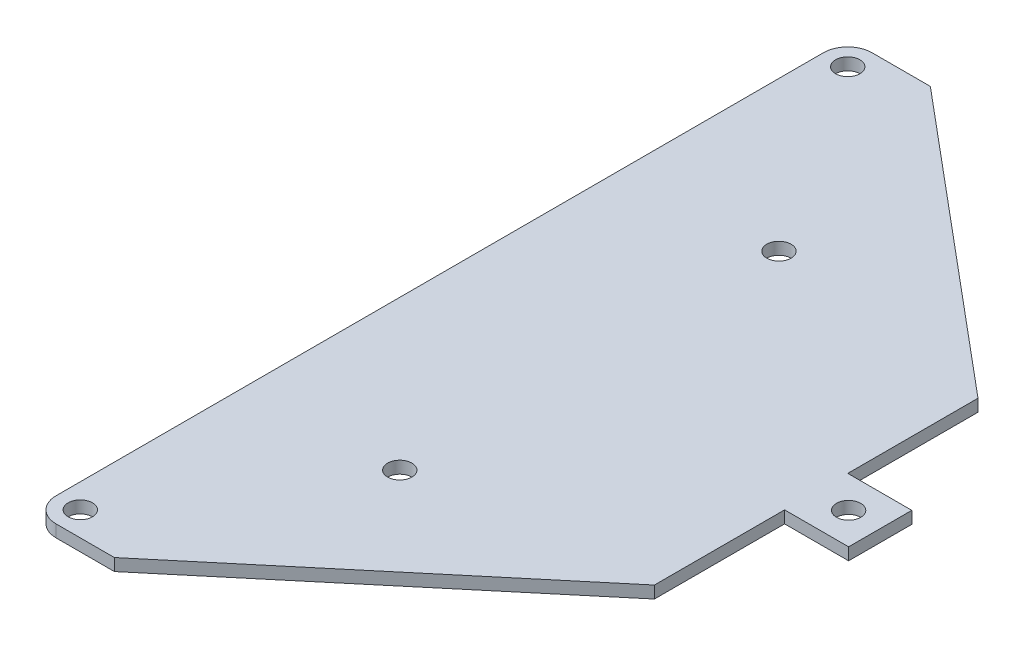
ISO-10303-21;
HEADER;
FILE_DESCRIPTION(('STEP AP214'),'2;1');
FILE_NAME('part.step','',(''),(''),'','','');
FILE_SCHEMA(('AUTOMOTIVE_DESIGN { 1 0 10303 214 1 1 1 1 }'));
ENDSEC;
DATA;
#1=APPLICATION_CONTEXT('core data for automotive mechanical design processes');
#2=APPLICATION_PROTOCOL_DEFINITION('international standard','automotive_design',2000,#1);
#3=PRODUCT_CONTEXT('',#1,'mechanical');
#4=PRODUCT('Part','Part','',(#3));
#5=PRODUCT_RELATED_PRODUCT_CATEGORY('part','',(#4));
#6=PRODUCT_DEFINITION_FORMATION('','',#4);
#7=PRODUCT_DEFINITION_CONTEXT('part definition',#1,'design');
#8=PRODUCT_DEFINITION('design','',#6,#7);
#9=PRODUCT_DEFINITION_SHAPE('','',#8);
#10=(LENGTH_UNIT() NAMED_UNIT(*) SI_UNIT(.MILLI.,.METRE.));
#11=(NAMED_UNIT(*) PLANE_ANGLE_UNIT() SI_UNIT($,.RADIAN.));
#12=(NAMED_UNIT(*) SI_UNIT($,.STERADIAN.) SOLID_ANGLE_UNIT());
#13=UNCERTAINTY_MEASURE_WITH_UNIT(LENGTH_MEASURE(1.E-05),#10,'distance_accuracy_value','');
#14=(GEOMETRIC_REPRESENTATION_CONTEXT(3) GLOBAL_UNCERTAINTY_ASSIGNED_CONTEXT((#13)) GLOBAL_UNIT_ASSIGNED_CONTEXT((#10,
#11,#12)) REPRESENTATION_CONTEXT('',''));
#15=CARTESIAN_POINT('',(0.,0.,0.));
#16=DIRECTION('',(0.,0.,1.));
#17=DIRECTION('',(1.,0.,0.));
#18=AXIS2_PLACEMENT_3D('',#15,#16,#17);
#19=CARTESIAN_POINT('',(0.,1.5,0.));
#20=DIRECTION('',(0.,-1.,0.));
#21=DIRECTION('',(0.,0.,-1.));
#22=AXIS2_PLACEMENT_3D('',#19,#20,#21);
#23=PLANE('',#22);
#24=DIRECTION('',(0.,0.,-1.));
#25=VECTOR('',#24,1.);
#26=CARTESIAN_POINT('',(43.47,1.5,43.46));
#27=LINE('',#26,#25);
#28=CARTESIAN_POINT('',(43.47,1.5,43.46));
#29=VERTEX_POINT('',#28);
#30=CARTESIAN_POINT('',(43.47,1.5,27.39));
#31=VERTEX_POINT('',#30);
#32=EDGE_CURVE('E181',#29,#31,#27,.T.);
#33=ORIENTED_EDGE('',*,*,#32,.T.);
#34=DIRECTION('',(-0.766503610582019,0.,-0.642239997948375));
#35=VECTOR('',#34,1.);
#36=CARTESIAN_POINT('',(43.47,1.5,27.39));
#37=LINE('',#36,#35);
#38=CARTESIAN_POINT('',(7.20000000000001,1.5,-3.));
#39=VERTEX_POINT('',#38);
#40=EDGE_CURVE('E112',#31,#39,#37,.T.);
#41=ORIENTED_EDGE('',*,*,#40,.T.);
#42=DIRECTION('',(-1.,0.,0.));
#43=VECTOR('',#42,1.);
#44=CARTESIAN_POINT('',(7.20000000000001,1.5,-3.));
#45=LINE('',#44,#43);
#46=CARTESIAN_POINT('',(0.,1.5,-3.));
#47=VERTEX_POINT('',#46);
#48=EDGE_CURVE('E209',#39,#47,#45,.T.);
#49=ORIENTED_EDGE('',*,*,#48,.T.);
#50=CARTESIAN_POINT('',(0.,1.5,0.));
#51=DIRECTION('',(0.,1.,0.));
#52=DIRECTION('',(0.,0.,-1.));
#53=AXIS2_PLACEMENT_3D('',#50,#51,#52);
#54=CIRCLE('',#53,3.);
#55=CARTESIAN_POINT('',(-3.,1.5,0.));
#56=VERTEX_POINT('',#55);
#57=EDGE_CURVE('E226',#47,#56,#54,.T.);
#58=ORIENTED_EDGE('',*,*,#57,.T.);
#59=DIRECTION('',(0.,0.,1.));
#60=VECTOR('',#59,1.);
#61=CARTESIAN_POINT('',(-3.,1.5,94.72));
#62=LINE('',#61,#60);
#63=CARTESIAN_POINT('',(-2.99999999999999,1.5,94.72));
#64=VERTEX_POINT('',#63);
#65=EDGE_CURVE('E227',#56,#64,#62,.T.);
#66=ORIENTED_EDGE('',*,*,#65,.T.);
#67=CARTESIAN_POINT('',(0.,1.5,94.72));
#68=DIRECTION('',(0.,1.,0.));
#69=DIRECTION('',(0.,0.,-1.));
#70=AXIS2_PLACEMENT_3D('',#67,#68,#69);
#71=CIRCLE('',#70,3.00000000000001);
#72=CARTESIAN_POINT('',(0.,1.5,97.72));
#73=VERTEX_POINT('',#72);
#74=EDGE_CURVE('E229',#64,#73,#71,.T.);
#75=ORIENTED_EDGE('',*,*,#74,.T.);
#76=DIRECTION('',(1.,0.,0.));
#77=VECTOR('',#76,1.);
#78=CARTESIAN_POINT('',(0.,1.5,97.72));
#79=LINE('',#78,#77);
#80=CARTESIAN_POINT('',(7.20000000000002,1.5,97.72));
#81=VERTEX_POINT('',#80);
#82=EDGE_CURVE('E231',#73,#81,#79,.T.);
#83=ORIENTED_EDGE('',*,*,#82,.T.);
#84=DIRECTION('',(0.766503610582019,0.,-0.642239997948375));
#85=VECTOR('',#84,1.);
#86=CARTESIAN_POINT('',(7.20000000000002,1.5,97.72));
#87=LINE('',#86,#85);
#88=CARTESIAN_POINT('',(43.47,1.5,67.33));
#89=VERTEX_POINT('',#88);
#90=EDGE_CURVE('E240',#81,#89,#87,.T.);
#91=ORIENTED_EDGE('',*,*,#90,.T.);
#92=DIRECTION('',(0.,0.,-1.));
#93=VECTOR('',#92,1.);
#94=CARTESIAN_POINT('',(43.47,1.5,67.33));
#95=LINE('',#94,#93);
#96=CARTESIAN_POINT('',(43.47,1.5,51.26));
#97=VERTEX_POINT('',#96);
#98=EDGE_CURVE('E142',#89,#97,#95,.T.);
#99=ORIENTED_EDGE('',*,*,#98,.T.);
#100=DIRECTION('',(1.,0.,0.));
#101=VECTOR('',#100,1.);
#102=CARTESIAN_POINT('',(51.37,1.5,51.26));
#103=LINE('',#102,#101);
#104=CARTESIAN_POINT('',(51.37,1.5,51.26));
#105=VERTEX_POINT('',#104);
#106=EDGE_CURVE('E136',#97,#105,#103,.T.);
#107=ORIENTED_EDGE('',*,*,#106,.T.);
#108=DIRECTION('',(0.,0.,-1.));
#109=VECTOR('',#108,1.);
#110=CARTESIAN_POINT('',(51.37,1.5,43.46));
#111=LINE('',#110,#109);
#112=CARTESIAN_POINT('',(51.37,1.5,43.46));
#113=VERTEX_POINT('',#112);
#114=EDGE_CURVE('E140',#105,#113,#111,.T.);
#115=ORIENTED_EDGE('',*,*,#114,.T.);
#116=DIRECTION('',(-1.,0.,0.));
#117=VECTOR('',#116,1.);
#118=CARTESIAN_POINT('',(43.47,1.5,43.46));
#119=LINE('',#118,#117);
#120=EDGE_CURVE('E57',#113,#29,#119,.T.);
#121=ORIENTED_EDGE('',*,*,#120,.T.);
#122=EDGE_LOOP('',(#33,#41,#49,#58,#66,#75,#83,#91,#99,#107,#115,#121));
#123=FACE_BOUND('',#122,.T.);
#124=CARTESIAN_POINT('',(0.,1.5,0.));
#125=DIRECTION('',(0.,1.,0.));
#126=DIRECTION('',(0.,0.,1.));
#127=AXIS2_PLACEMENT_3D('',#124,#125,#126);
#128=CIRCLE('',#127,1.5);
#129=CARTESIAN_POINT('',(0.,1.5,1.5));
#130=VERTEX_POINT('',#129);
#131=EDGE_CURVE('E163',#130,#130,#128,.T.);
#132=ORIENTED_EDGE('',*,*,#131,.F.);
#133=EDGE_LOOP('',(#132));
#134=FACE_BOUND('',#133,.T.);
#135=CARTESIAN_POINT('',(0.,1.5,94.72));
#136=DIRECTION('',(0.,1.,0.));
#137=DIRECTION('',(0.,0.,1.));
#138=AXIS2_PLACEMENT_3D('',#135,#136,#137);
#139=CIRCLE('',#138,1.5);
#140=CARTESIAN_POINT('',(0.,1.5,96.22));
#141=VERTEX_POINT('',#140);
#142=EDGE_CURVE('E313',#141,#141,#139,.T.);
#143=ORIENTED_EDGE('',*,*,#142,.F.);
#144=EDGE_LOOP('',(#143));
#145=FACE_BOUND('',#144,.T.);
#146=CARTESIAN_POINT('',(47.47,1.5,47.36));
#147=DIRECTION('',(0.,1.,0.));
#148=DIRECTION('',(0.,0.,1.));
#149=AXIS2_PLACEMENT_3D('',#146,#147,#148);
#150=CIRCLE('',#149,1.5);
#151=CARTESIAN_POINT('',(47.47,1.5,48.86));
#152=VERTEX_POINT('',#151);
#153=EDGE_CURVE('E305',#152,#152,#150,.T.);
#154=ORIENTED_EDGE('',*,*,#153,.F.);
#155=EDGE_LOOP('',(#154));
#156=FACE_BOUND('',#155,.T.);
#157=CARTESIAN_POINT('',(15.47,1.5,70.76));
#158=DIRECTION('',(0.,1.,0.));
#159=DIRECTION('',(0.,0.,1.));
#160=AXIS2_PLACEMENT_3D('',#157,#158,#159);
#161=CIRCLE('',#160,1.5);
#162=CARTESIAN_POINT('',(15.47,1.5,72.26));
#163=VERTEX_POINT('',#162);
#164=EDGE_CURVE('E296',#163,#163,#161,.T.);
#165=ORIENTED_EDGE('',*,*,#164,.F.);
#166=EDGE_LOOP('',(#165));
#167=FACE_BOUND('',#166,.T.);
#168=CARTESIAN_POINT('',(15.47,1.5,23.96));
#169=DIRECTION('',(0.,1.,0.));
#170=DIRECTION('',(0.,0.,1.));
#171=AXIS2_PLACEMENT_3D('',#168,#169,#170);
#172=CIRCLE('',#171,1.5);
#173=CARTESIAN_POINT('',(15.47,1.5,25.46));
#174=VERTEX_POINT('',#173);
#175=EDGE_CURVE('E290',#174,#174,#172,.T.);
#176=ORIENTED_EDGE('',*,*,#175,.F.);
#177=EDGE_LOOP('',(#176));
#178=FACE_BOUND('',#177,.T.);
#179=ADVANCED_FACE('F39',(#123,#134,#145,#156,#167,#178),#23,.F.);
#180=CARTESIAN_POINT('',(0.,0.,0.));
#181=DIRECTION('',(0.,-1.,0.));
#182=DIRECTION('',(0.,0.,-1.));
#183=AXIS2_PLACEMENT_3D('',#180,#181,#182);
#184=PLANE('',#183);
#185=CARTESIAN_POINT('',(15.47,0.,70.76));
#186=DIRECTION('',(0.,1.,0.));
#187=DIRECTION('',(0.,0.,1.));
#188=AXIS2_PLACEMENT_3D('',#185,#186,#187);
#189=CIRCLE('',#188,1.5);
#190=CARTESIAN_POINT('',(15.47,0.,72.26));
#191=VERTEX_POINT('',#190);
#192=EDGE_CURVE('E297',#191,#191,#189,.T.);
#193=ORIENTED_EDGE('',*,*,#192,.T.);
#194=EDGE_LOOP('',(#193));
#195=FACE_BOUND('',#194,.T.);
#196=CARTESIAN_POINT('',(0.,0.,94.72));
#197=DIRECTION('',(0.,1.,0.));
#198=DIRECTION('',(0.,0.,1.));
#199=AXIS2_PLACEMENT_3D('',#196,#197,#198);
#200=CIRCLE('',#199,1.5);
#201=CARTESIAN_POINT('',(0.,0.,96.22));
#202=VERTEX_POINT('',#201);
#203=EDGE_CURVE('E306',#202,#202,#200,.T.);
#204=ORIENTED_EDGE('',*,*,#203,.T.);
#205=EDGE_LOOP('',(#204));
#206=FACE_BOUND('',#205,.T.);
#207=DIRECTION('',(0.,0.,-1.));
#208=VECTOR('',#207,1.);
#209=CARTESIAN_POINT('',(43.47,0.,43.46));
#210=LINE('',#209,#208);
#211=CARTESIAN_POINT('',(43.47,0.,43.46));
#212=VERTEX_POINT('',#211);
#213=CARTESIAN_POINT('',(43.47,0.,27.39));
#214=VERTEX_POINT('',#213);
#215=EDGE_CURVE('E159',#212,#214,#210,.T.);
#216=ORIENTED_EDGE('',*,*,#215,.F.);
#217=DIRECTION('',(-1.,0.,0.));
#218=VECTOR('',#217,1.);
#219=CARTESIAN_POINT('',(43.47,0.,43.46));
#220=LINE('',#219,#218);
#221=CARTESIAN_POINT('',(51.37,0.,43.46));
#222=VERTEX_POINT('',#221);
#223=EDGE_CURVE('E103',#222,#212,#220,.T.);
#224=ORIENTED_EDGE('',*,*,#223,.F.);
#225=DIRECTION('',(0.,0.,-1.));
#226=VECTOR('',#225,1.);
#227=CARTESIAN_POINT('',(51.37,0.,43.46));
#228=LINE('',#227,#226);
#229=CARTESIAN_POINT('',(51.37,0.,51.26));
#230=VERTEX_POINT('',#229);
#231=EDGE_CURVE('E100',#230,#222,#228,.T.);
#232=ORIENTED_EDGE('',*,*,#231,.F.);
#233=DIRECTION('',(1.,0.,0.));
#234=VECTOR('',#233,1.);
#235=CARTESIAN_POINT('',(51.37,0.,51.26));
#236=LINE('',#235,#234);
#237=CARTESIAN_POINT('',(43.47,0.,51.26));
#238=VERTEX_POINT('',#237);
#239=EDGE_CURVE('E147',#238,#230,#236,.T.);
#240=ORIENTED_EDGE('',*,*,#239,.F.);
#241=DIRECTION('',(0.,0.,-1.));
#242=VECTOR('',#241,1.);
#243=CARTESIAN_POINT('',(43.47,0.,67.33));
#244=LINE('',#243,#242);
#245=CARTESIAN_POINT('',(43.47,0.,67.33));
#246=VERTEX_POINT('',#245);
#247=EDGE_CURVE('E179',#246,#238,#244,.T.);
#248=ORIENTED_EDGE('',*,*,#247,.F.);
#249=DIRECTION('',(0.766503610582019,0.,-0.642239997948375));
#250=VECTOR('',#249,1.);
#251=CARTESIAN_POINT('',(7.20000000000002,0.,97.72));
#252=LINE('',#251,#250);
#253=CARTESIAN_POINT('',(7.20000000000002,0.,97.72));
#254=VERTEX_POINT('',#253);
#255=EDGE_CURVE('E176',#254,#246,#252,.T.);
#256=ORIENTED_EDGE('',*,*,#255,.F.);
#257=DIRECTION('',(1.,0.,0.));
#258=VECTOR('',#257,1.);
#259=CARTESIAN_POINT('',(0.,0.,97.72));
#260=LINE('',#259,#258);
#261=CARTESIAN_POINT('',(0.,0.,97.72));
#262=VERTEX_POINT('',#261);
#263=EDGE_CURVE('E171',#262,#254,#260,.T.);
#264=ORIENTED_EDGE('',*,*,#263,.F.);
#265=CARTESIAN_POINT('',(0.,0.,94.72));
#266=DIRECTION('',(0.,1.,0.));
#267=DIRECTION('',(0.,0.,-1.));
#268=AXIS2_PLACEMENT_3D('',#265,#266,#267);
#269=CIRCLE('',#268,3.00000000000001);
#270=CARTESIAN_POINT('',(-2.99999999999999,0.,94.72));
#271=VERTEX_POINT('',#270);
#272=EDGE_CURVE('E175',#271,#262,#269,.T.);
#273=ORIENTED_EDGE('',*,*,#272,.F.);
#274=DIRECTION('',(0.,0.,1.));
#275=VECTOR('',#274,1.);
#276=CARTESIAN_POINT('',(-3.,0.,94.72));
#277=LINE('',#276,#275);
#278=CARTESIAN_POINT('',(-3.,0.,0.));
#279=VERTEX_POINT('',#278);
#280=EDGE_CURVE('E168',#279,#271,#277,.T.);
#281=ORIENTED_EDGE('',*,*,#280,.F.);
#282=CARTESIAN_POINT('',(0.,0.,0.));
#283=DIRECTION('',(0.,1.,0.));
#284=DIRECTION('',(0.,0.,-1.));
#285=AXIS2_PLACEMENT_3D('',#282,#283,#284);
#286=CIRCLE('',#285,3.);
#287=CARTESIAN_POINT('',(0.,0.,-3.));
#288=VERTEX_POINT('',#287);
#289=EDGE_CURVE('E169',#288,#279,#286,.T.);
#290=ORIENTED_EDGE('',*,*,#289,.F.);
#291=DIRECTION('',(-1.,0.,0.));
#292=VECTOR('',#291,1.);
#293=CARTESIAN_POINT('',(7.20000000000001,0.,-3.));
#294=LINE('',#293,#292);
#295=CARTESIAN_POINT('',(7.20000000000001,0.,-3.));
#296=VERTEX_POINT('',#295);
#297=EDGE_CURVE('E167',#296,#288,#294,.T.);
#298=ORIENTED_EDGE('',*,*,#297,.F.);
#299=DIRECTION('',(-0.766503610582019,0.,-0.642239997948375));
#300=VECTOR('',#299,1.);
#301=CARTESIAN_POINT('',(43.47,0.,27.39));
#302=LINE('',#301,#300);
#303=EDGE_CURVE('E162',#214,#296,#302,.T.);
#304=ORIENTED_EDGE('',*,*,#303,.F.);
#305=EDGE_LOOP('',(#216,#224,#232,#240,#248,#256,#264,#273,#281,#290,#298,#304));
#306=FACE_BOUND('',#305,.T.);
#307=CARTESIAN_POINT('',(0.,0.,0.));
#308=DIRECTION('',(0.,1.,0.));
#309=DIRECTION('',(0.,0.,1.));
#310=AXIS2_PLACEMENT_3D('',#307,#308,#309);
#311=CIRCLE('',#310,1.5);
#312=CARTESIAN_POINT('',(0.,0.,1.5));
#313=VERTEX_POINT('',#312);
#314=EDGE_CURVE('E314',#313,#313,#311,.T.);
#315=ORIENTED_EDGE('',*,*,#314,.T.);
#316=EDGE_LOOP('',(#315));
#317=FACE_BOUND('',#316,.T.);
#318=CARTESIAN_POINT('',(47.47,0.,47.36));
#319=DIRECTION('',(0.,1.,0.));
#320=DIRECTION('',(0.,0.,1.));
#321=AXIS2_PLACEMENT_3D('',#318,#319,#320);
#322=CIRCLE('',#321,1.5);
#323=CARTESIAN_POINT('',(47.47,0.,48.86));
#324=VERTEX_POINT('',#323);
#325=EDGE_CURVE('E302',#324,#324,#322,.T.);
#326=ORIENTED_EDGE('',*,*,#325,.T.);
#327=EDGE_LOOP('',(#326));
#328=FACE_BOUND('',#327,.T.);
#329=CARTESIAN_POINT('',(15.47,0.,23.96));
#330=DIRECTION('',(0.,1.,0.));
#331=DIRECTION('',(0.,0.,1.));
#332=AXIS2_PLACEMENT_3D('',#329,#330,#331);
#333=CIRCLE('',#332,1.5);
#334=CARTESIAN_POINT('',(15.47,0.,25.46));
#335=VERTEX_POINT('',#334);
#336=EDGE_CURVE('E291',#335,#335,#333,.T.);
#337=ORIENTED_EDGE('',*,*,#336,.T.);
#338=EDGE_LOOP('',(#337));
#339=FACE_BOUND('',#338,.T.);
#340=ADVANCED_FACE('F212',(#195,#206,#306,#317,#328,#339),#184,.T.);
#341=CARTESIAN_POINT('',(43.47,1.5,43.46));
#342=DIRECTION('',(-1.,0.,0.));
#343=DIRECTION('',(0.,0.,1.));
#344=AXIS2_PLACEMENT_3D('',#341,#342,#343);
#345=PLANE('',#344);
#346=ORIENTED_EDGE('',*,*,#215,.T.);
#347=DIRECTION('',(0.,-1.,0.));
#348=VECTOR('',#347,1.);
#349=CARTESIAN_POINT('',(43.47,1.5,27.39));
#350=LINE('',#349,#348);
#351=EDGE_CURVE('E11',#31,#214,#350,.T.);
#352=ORIENTED_EDGE('',*,*,#351,.F.);
#353=ORIENTED_EDGE('',*,*,#32,.F.);
#354=DIRECTION('',(0.,-1.,0.));
#355=VECTOR('',#354,1.);
#356=CARTESIAN_POINT('',(43.47,1.5,43.46));
#357=LINE('',#356,#355);
#358=EDGE_CURVE('E156',#29,#212,#357,.T.);
#359=ORIENTED_EDGE('',*,*,#358,.T.);
#360=EDGE_LOOP('',(#346,#352,#353,#359));
#361=FACE_BOUND('',#360,.T.);
#362=ADVANCED_FACE('F41',(#361),#345,.F.);
#363=CARTESIAN_POINT('',(43.47,1.5,27.39));
#364=DIRECTION('',(-0.642239997948375,0.,0.766503610582019));
#365=DIRECTION('',(0.766503610582019,0.,0.642239997948375));
#366=AXIS2_PLACEMENT_3D('',#363,#364,#365);
#367=PLANE('',#366);
#368=ORIENTED_EDGE('',*,*,#303,.T.);
#369=DIRECTION('',(0.,-1.,0.));
#370=VECTOR('',#369,1.);
#371=CARTESIAN_POINT('',(7.20000000000001,1.5,-3.));
#372=LINE('',#371,#370);
#373=EDGE_CURVE('E48',#39,#296,#372,.T.);
#374=ORIENTED_EDGE('',*,*,#373,.F.);
#375=ORIENTED_EDGE('',*,*,#40,.F.);
#376=ORIENTED_EDGE('',*,*,#351,.T.);
#377=EDGE_LOOP('',(#368,#374,#375,#376));
#378=FACE_BOUND('',#377,.T.);
#379=ADVANCED_FACE('F439',(#378),#367,.F.);
#380=CARTESIAN_POINT('',(7.20000000000001,1.5,-3.));
#381=DIRECTION('',(0.,0.,1.));
#382=DIRECTION('',(1.,0.,0.));
#383=AXIS2_PLACEMENT_3D('',#380,#381,#382);
#384=PLANE('',#383);
#385=ORIENTED_EDGE('',*,*,#297,.T.);
#386=DIRECTION('',(0.,-1.,0.));
#387=VECTOR('',#386,1.);
#388=CARTESIAN_POINT('',(0.,1.5,-3.));
#389=LINE('',#388,#387);
#390=EDGE_CURVE('E205',#47,#288,#389,.T.);
#391=ORIENTED_EDGE('',*,*,#390,.F.);
#392=ORIENTED_EDGE('',*,*,#48,.F.);
#393=ORIENTED_EDGE('',*,*,#373,.T.);
#394=EDGE_LOOP('',(#385,#391,#392,#393));
#395=FACE_BOUND('',#394,.T.);
#396=ADVANCED_FACE('F208',(#395),#384,.F.);
#397=CARTESIAN_POINT('',(0.,1.5,0.));
#398=DIRECTION('',(0.,-1.,0.));
#399=DIRECTION('',(0.,0.,-1.));
#400=AXIS2_PLACEMENT_3D('',#397,#398,#399);
#401=CYLINDRICAL_SURFACE('',#400,3.);
#402=ORIENTED_EDGE('',*,*,#289,.T.);
#403=DIRECTION('',(0.,-1.,0.));
#404=VECTOR('',#403,1.);
#405=CARTESIAN_POINT('',(-3.,1.5,0.));
#406=LINE('',#405,#404);
#407=EDGE_CURVE('E200',#56,#279,#406,.T.);
#408=ORIENTED_EDGE('',*,*,#407,.F.);
#409=ORIENTED_EDGE('',*,*,#57,.F.);
#410=ORIENTED_EDGE('',*,*,#390,.T.);
#411=EDGE_LOOP('',(#402,#408,#409,#410));
#412=FACE_BOUND('',#411,.T.);
#413=ADVANCED_FACE('F219',(#412),#401,.T.);
#414=CARTESIAN_POINT('',(-3.,1.5,94.72));
#415=DIRECTION('',(1.,0.,0.));
#416=DIRECTION('',(0.,0.,-1.));
#417=AXIS2_PLACEMENT_3D('',#414,#415,#416);
#418=PLANE('',#417);
#419=ORIENTED_EDGE('',*,*,#280,.T.);
#420=DIRECTION('',(0.,-1.,0.));
#421=VECTOR('',#420,1.);
#422=CARTESIAN_POINT('',(-2.99999999999999,1.5,94.72));
#423=LINE('',#422,#421);
#424=EDGE_CURVE('E198',#64,#271,#423,.T.);
#425=ORIENTED_EDGE('',*,*,#424,.F.);
#426=ORIENTED_EDGE('',*,*,#65,.F.);
#427=ORIENTED_EDGE('',*,*,#407,.T.);
#428=EDGE_LOOP('',(#419,#425,#426,#427));
#429=FACE_BOUND('',#428,.T.);
#430=ADVANCED_FACE('F221',(#429),#418,.F.);
#431=CARTESIAN_POINT('',(0.,1.5,94.72));
#432=DIRECTION('',(0.,-1.,0.));
#433=DIRECTION('',(0.,0.,-1.));
#434=AXIS2_PLACEMENT_3D('',#431,#432,#433);
#435=CYLINDRICAL_SURFACE('',#434,3.00000000000001);
#436=ORIENTED_EDGE('',*,*,#272,.T.);
#437=DIRECTION('',(0.,-1.,0.));
#438=VECTOR('',#437,1.);
#439=CARTESIAN_POINT('',(0.,1.5,97.72));
#440=LINE('',#439,#438);
#441=EDGE_CURVE('E194',#73,#262,#440,.T.);
#442=ORIENTED_EDGE('',*,*,#441,.F.);
#443=ORIENTED_EDGE('',*,*,#74,.F.);
#444=ORIENTED_EDGE('',*,*,#424,.T.);
#445=EDGE_LOOP('',(#436,#442,#443,#444));
#446=FACE_BOUND('',#445,.T.);
#447=ADVANCED_FACE('F403',(#446),#435,.T.);
#448=CARTESIAN_POINT('',(0.,1.5,97.72));
#449=DIRECTION('',(0.,0.,-1.));
#450=DIRECTION('',(-1.,0.,0.));
#451=AXIS2_PLACEMENT_3D('',#448,#449,#450);
#452=PLANE('',#451);
#453=ORIENTED_EDGE('',*,*,#263,.T.);
#454=DIRECTION('',(0.,-1.,0.));
#455=VECTOR('',#454,1.);
#456=CARTESIAN_POINT('',(7.20000000000002,1.5,97.72));
#457=LINE('',#456,#455);
#458=EDGE_CURVE('E188',#81,#254,#457,.T.);
#459=ORIENTED_EDGE('',*,*,#458,.F.);
#460=ORIENTED_EDGE('',*,*,#82,.F.);
#461=ORIENTED_EDGE('',*,*,#441,.T.);
#462=EDGE_LOOP('',(#453,#459,#460,#461));
#463=FACE_BOUND('',#462,.T.);
#464=ADVANCED_FACE('F396',(#463),#452,.F.);
#465=CARTESIAN_POINT('',(7.20000000000002,1.5,97.72));
#466=DIRECTION('',(-0.642239997948375,0.,-0.766503610582019));
#467=DIRECTION('',(-0.766503610582019,0.,0.642239997948375));
#468=AXIS2_PLACEMENT_3D('',#465,#466,#467);
#469=PLANE('',#468);
#470=ORIENTED_EDGE('',*,*,#255,.T.);
#471=DIRECTION('',(0.,-1.,0.));
#472=VECTOR('',#471,1.);
#473=CARTESIAN_POINT('',(43.47,1.5,67.33));
#474=LINE('',#473,#472);
#475=EDGE_CURVE('E190',#89,#246,#474,.T.);
#476=ORIENTED_EDGE('',*,*,#475,.F.);
#477=ORIENTED_EDGE('',*,*,#90,.F.);
#478=ORIENTED_EDGE('',*,*,#458,.T.);
#479=EDGE_LOOP('',(#470,#476,#477,#478));
#480=FACE_BOUND('',#479,.T.);
#481=ADVANCED_FACE('F244',(#480),#469,.F.);
#482=CARTESIAN_POINT('',(43.47,1.5,67.33));
#483=DIRECTION('',(-1.,0.,0.));
#484=DIRECTION('',(0.,0.,1.));
#485=AXIS2_PLACEMENT_3D('',#482,#483,#484);
#486=PLANE('',#485);
#487=ORIENTED_EDGE('',*,*,#247,.T.);
#488=DIRECTION('',(0.,-1.,0.));
#489=VECTOR('',#488,1.);
#490=CARTESIAN_POINT('',(43.47,1.5,51.26));
#491=LINE('',#490,#489);
#492=EDGE_CURVE('E151',#97,#238,#491,.T.);
#493=ORIENTED_EDGE('',*,*,#492,.F.);
#494=ORIENTED_EDGE('',*,*,#98,.F.);
#495=ORIENTED_EDGE('',*,*,#475,.T.);
#496=EDGE_LOOP('',(#487,#493,#494,#495));
#497=FACE_BOUND('',#496,.T.);
#498=ADVANCED_FACE('F247',(#497),#486,.F.);
#499=CARTESIAN_POINT('',(51.37,1.5,51.26));
#500=DIRECTION('',(0.,0.,-1.));
#501=DIRECTION('',(-1.,0.,0.));
#502=AXIS2_PLACEMENT_3D('',#499,#500,#501);
#503=PLANE('',#502);
#504=ORIENTED_EDGE('',*,*,#239,.T.);
#505=DIRECTION('',(0.,-1.,0.));
#506=VECTOR('',#505,1.);
#507=CARTESIAN_POINT('',(51.37,1.5,51.26));
#508=LINE('',#507,#506);
#509=EDGE_CURVE('E150',#105,#230,#508,.T.);
#510=ORIENTED_EDGE('',*,*,#509,.F.);
#511=ORIENTED_EDGE('',*,*,#106,.F.);
#512=ORIENTED_EDGE('',*,*,#492,.T.);
#513=EDGE_LOOP('',(#504,#510,#511,#512));
#514=FACE_BOUND('',#513,.T.);
#515=ADVANCED_FACE('F146',(#514),#503,.F.);
#516=CARTESIAN_POINT('',(51.37,1.5,43.46));
#517=DIRECTION('',(-1.,0.,0.));
#518=DIRECTION('',(0.,0.,1.));
#519=AXIS2_PLACEMENT_3D('',#516,#517,#518);
#520=PLANE('',#519);
#521=ORIENTED_EDGE('',*,*,#231,.T.);
#522=DIRECTION('',(0.,-1.,0.));
#523=VECTOR('',#522,1.);
#524=CARTESIAN_POINT('',(51.37,1.5,43.46));
#525=LINE('',#524,#523);
#526=EDGE_CURVE('E155',#113,#222,#525,.T.);
#527=ORIENTED_EDGE('',*,*,#526,.F.);
#528=ORIENTED_EDGE('',*,*,#114,.F.);
#529=ORIENTED_EDGE('',*,*,#509,.T.);
#530=EDGE_LOOP('',(#521,#527,#528,#529));
#531=FACE_BOUND('',#530,.T.);
#532=ADVANCED_FACE('F152',(#531),#520,.F.);
#533=CARTESIAN_POINT('',(43.47,1.5,43.46));
#534=DIRECTION('',(0.,0.,1.));
#535=DIRECTION('',(1.,0.,0.));
#536=AXIS2_PLACEMENT_3D('',#533,#534,#535);
#537=PLANE('',#536);
#538=ORIENTED_EDGE('',*,*,#223,.T.);
#539=ORIENTED_EDGE('',*,*,#358,.F.);
#540=ORIENTED_EDGE('',*,*,#120,.F.);
#541=ORIENTED_EDGE('',*,*,#526,.T.);
#542=EDGE_LOOP('',(#538,#539,#540,#541));
#543=FACE_BOUND('',#542,.T.);
#544=ADVANCED_FACE('F253',(#543),#537,.F.);
#545=CARTESIAN_POINT('',(0.,1.5,0.));
#546=DIRECTION('',(0.,-1.,0.));
#547=DIRECTION('',(0.,0.,-1.));
#548=AXIS2_PLACEMENT_3D('',#545,#546,#547);
#549=CYLINDRICAL_SURFACE('',#548,1.5);
#550=ORIENTED_EDGE('',*,*,#131,.T.);
#551=EDGE_LOOP('',(#550));
#552=FACE_BOUND('',#551,.T.);
#553=ORIENTED_EDGE('',*,*,#314,.F.);
#554=EDGE_LOOP('',(#553));
#555=FACE_BOUND('',#554,.T.);
#556=ADVANCED_FACE('F251',(#552,#555),#549,.F.);
#557=CARTESIAN_POINT('',(0.,1.5,94.72));
#558=DIRECTION('',(0.,-1.,0.));
#559=DIRECTION('',(0.,0.,-1.));
#560=AXIS2_PLACEMENT_3D('',#557,#558,#559);
#561=CYLINDRICAL_SURFACE('',#560,1.5);
#562=ORIENTED_EDGE('',*,*,#142,.T.);
#563=EDGE_LOOP('',(#562));
#564=FACE_BOUND('',#563,.T.);
#565=ORIENTED_EDGE('',*,*,#203,.F.);
#566=EDGE_LOOP('',(#565));
#567=FACE_BOUND('',#566,.T.);
#568=ADVANCED_FACE('F259',(#564,#567),#561,.F.);
#569=CARTESIAN_POINT('',(47.47,1.5,47.36));
#570=DIRECTION('',(0.,-1.,0.));
#571=DIRECTION('',(0.,0.,-1.));
#572=AXIS2_PLACEMENT_3D('',#569,#570,#571);
#573=CYLINDRICAL_SURFACE('',#572,1.5);
#574=ORIENTED_EDGE('',*,*,#153,.T.);
#575=EDGE_LOOP('',(#574));
#576=FACE_BOUND('',#575,.T.);
#577=ORIENTED_EDGE('',*,*,#325,.F.);
#578=EDGE_LOOP('',(#577));
#579=FACE_BOUND('',#578,.T.);
#580=ADVANCED_FACE('F272',(#576,#579),#573,.F.);
#581=CARTESIAN_POINT('',(15.47,1.5,70.76));
#582=DIRECTION('',(0.,-1.,0.));
#583=DIRECTION('',(0.,0.,-1.));
#584=AXIS2_PLACEMENT_3D('',#581,#582,#583);
#585=CYLINDRICAL_SURFACE('',#584,1.5);
#586=ORIENTED_EDGE('',*,*,#164,.T.);
#587=EDGE_LOOP('',(#586));
#588=FACE_BOUND('',#587,.T.);
#589=ORIENTED_EDGE('',*,*,#192,.F.);
#590=EDGE_LOOP('',(#589));
#591=FACE_BOUND('',#590,.T.);
#592=ADVANCED_FACE('F280',(#588,#591),#585,.F.);
#593=CARTESIAN_POINT('',(15.47,1.5,23.96));
#594=DIRECTION('',(0.,-1.,0.));
#595=DIRECTION('',(0.,0.,-1.));
#596=AXIS2_PLACEMENT_3D('',#593,#594,#595);
#597=CYLINDRICAL_SURFACE('',#596,1.5);
#598=ORIENTED_EDGE('',*,*,#175,.T.);
#599=EDGE_LOOP('',(#598));
#600=FACE_BOUND('',#599,.T.);
#601=ORIENTED_EDGE('',*,*,#336,.F.);
#602=EDGE_LOOP('',(#601));
#603=FACE_BOUND('',#602,.T.);
#604=ADVANCED_FACE('F282',(#600,#603),#597,.F.);
#605=CLOSED_SHELL('',(#179,#340,#362,#379,#396,#413,#430,#447,#464,#481,#498,#515,#532,#544,
#556,#568,#580,#592,#604));
#606=MANIFOLD_SOLID_BREP('B2',#605);
#607=ADVANCED_BREP_SHAPE_REPRESENTATION('',(#18,#606),#14);
#608=SHAPE_DEFINITION_REPRESENTATION(#9,#607);
ENDSEC;
END-ISO-10303-21;
